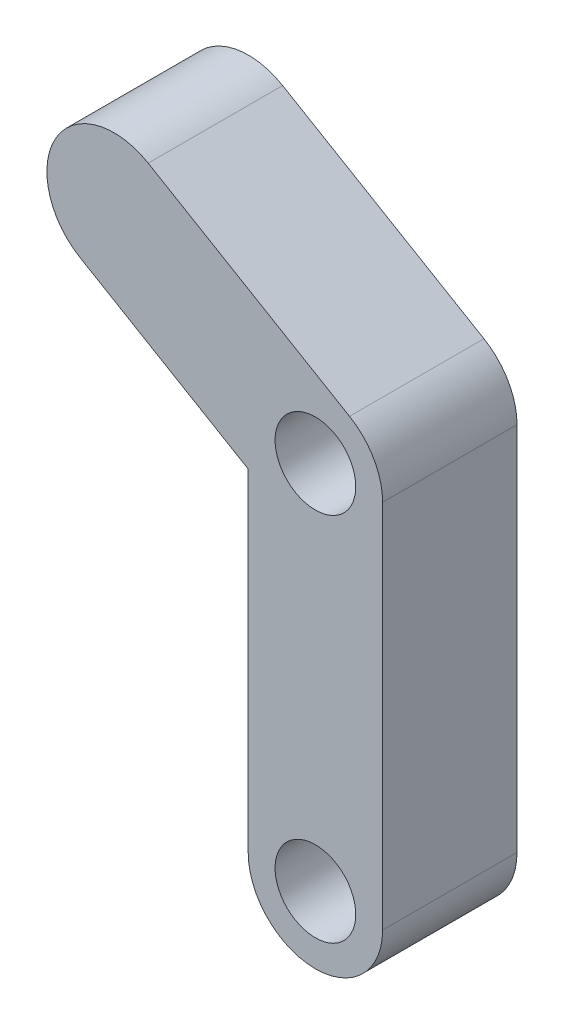
ISO-10303-21;
HEADER;
FILE_DESCRIPTION(('STEP AP214'),'2;1');
FILE_NAME('part.step','',(''),(''),'','','');
FILE_SCHEMA(('AUTOMOTIVE_DESIGN { 1 0 10303 214 1 1 1 1 }'));
ENDSEC;
DATA;
#1=APPLICATION_CONTEXT('core data for automotive mechanical design processes');
#2=APPLICATION_PROTOCOL_DEFINITION('international standard','automotive_design',2000,#1);
#3=PRODUCT_CONTEXT('',#1,'mechanical');
#4=PRODUCT('Part','Part','',(#3));
#5=PRODUCT_RELATED_PRODUCT_CATEGORY('part','',(#4));
#6=PRODUCT_DEFINITION_FORMATION('','',#4);
#7=PRODUCT_DEFINITION_CONTEXT('part definition',#1,'design');
#8=PRODUCT_DEFINITION('design','',#6,#7);
#9=PRODUCT_DEFINITION_SHAPE('','',#8);
#10=(LENGTH_UNIT() NAMED_UNIT(*) SI_UNIT(.MILLI.,.METRE.));
#11=(NAMED_UNIT(*) PLANE_ANGLE_UNIT() SI_UNIT($,.RADIAN.));
#12=(NAMED_UNIT(*) SI_UNIT($,.STERADIAN.) SOLID_ANGLE_UNIT());
#13=UNCERTAINTY_MEASURE_WITH_UNIT(LENGTH_MEASURE(1.E-05),#10,'distance_accuracy_value','');
#14=(GEOMETRIC_REPRESENTATION_CONTEXT(3) GLOBAL_UNCERTAINTY_ASSIGNED_CONTEXT((#13)) GLOBAL_UNIT_ASSIGNED_CONTEXT((#10,
#11,#12)) REPRESENTATION_CONTEXT('',''));
#15=CARTESIAN_POINT('',(0.,0.,0.));
#16=DIRECTION('',(0.,0.,1.));
#17=DIRECTION('',(1.,0.,0.));
#18=AXIS2_PLACEMENT_3D('',#15,#16,#17);
#19=CARTESIAN_POINT('',(4.75728387478869,8.0762653823934,5.));
#20=DIRECTION('',(-0.507538362960708,-0.861629160441523,0.));
#21=DIRECTION('',(0.861629160441523,-0.507538362960708,0.));
#22=AXIS2_PLACEMENT_3D('',#19,#20,#21);
#23=PLANE('',#22);
#24=DIRECTION('',(-0.861629160441523,0.507538362960708,0.));
#25=VECTOR('',#24,1.);
#26=CARTESIAN_POINT('',(4.75728387478869,8.0762653823934,0.));
#27=LINE('',#26,#25);
#28=CARTESIAN_POINT('',(-2.5,12.3511322815869,0.));
#29=VERTEX_POINT('',#28);
#30=CARTESIAN_POINT('',(-8.75690329610147,16.0367299863809,0.));
#31=VERTEX_POINT('',#30);
#32=EDGE_CURVE('E137',#29,#31,#27,.T.);
#33=ORIENTED_EDGE('',*,*,#32,.F.);
#34=DIRECTION('',(0.,0.,-1.));
#35=VECTOR('',#34,1.);
#36=CARTESIAN_POINT('',(-2.5,12.3511322815869,5.));
#37=LINE('',#36,#35);
#38=CARTESIAN_POINT('',(-2.5,12.3511322815869,5.));
#39=VERTEX_POINT('',#38);
#40=EDGE_CURVE('E11',#39,#29,#37,.T.);
#41=ORIENTED_EDGE('',*,*,#40,.F.);
#42=DIRECTION('',(-0.861629160441523,0.507538362960708,0.));
#43=VECTOR('',#42,1.);
#44=CARTESIAN_POINT('',(4.75728387478869,8.0762653823934,5.));
#45=LINE('',#44,#43);
#46=CARTESIAN_POINT('',(-8.75690329610147,16.0367299863809,5.));
#47=VERTEX_POINT('',#46);
#48=EDGE_CURVE('E159',#39,#47,#45,.T.);
#49=ORIENTED_EDGE('',*,*,#48,.T.);
#50=DIRECTION('',(0.,0.,-1.));
#51=VECTOR('',#50,1.);
#52=CARTESIAN_POINT('',(-8.75690329610147,16.0367299863809,5.));
#53=LINE('',#52,#51);
#54=EDGE_CURVE('E90',#47,#31,#53,.T.);
#55=ORIENTED_EDGE('',*,*,#54,.T.);
#56=EDGE_LOOP('',(#33,#41,#49,#55));
#57=FACE_BOUND('',#56,.T.);
#58=ADVANCED_FACE('F43',(#57),#23,.T.);
#59=CARTESIAN_POINT('',(-2.5,0.,5.));
#60=DIRECTION('',(1.,0.,0.));
#61=DIRECTION('',(0.,1.,0.));
#62=AXIS2_PLACEMENT_3D('',#59,#60,#61);
#63=PLANE('',#62);
#64=DIRECTION('',(0.,-1.,0.));
#65=VECTOR('',#64,1.);
#66=CARTESIAN_POINT('',(-2.5,0.,0.));
#67=LINE('',#66,#65);
#68=CARTESIAN_POINT('',(-2.5,0.,0.));
#69=VERTEX_POINT('',#68);
#70=EDGE_CURVE('E140',#29,#69,#67,.T.);
#71=ORIENTED_EDGE('',*,*,#70,.T.);
#72=DIRECTION('',(0.,0.,-1.));
#73=VECTOR('',#72,1.);
#74=CARTESIAN_POINT('',(-2.5,0.,5.));
#75=LINE('',#74,#73);
#76=CARTESIAN_POINT('',(-2.5,0.,5.));
#77=VERTEX_POINT('',#76);
#78=EDGE_CURVE('E51',#77,#69,#75,.T.);
#79=ORIENTED_EDGE('',*,*,#78,.F.);
#80=DIRECTION('',(0.,-1.,0.));
#81=VECTOR('',#80,1.);
#82=CARTESIAN_POINT('',(-2.5,0.,5.));
#83=LINE('',#82,#81);
#84=EDGE_CURVE('E180',#39,#77,#83,.T.);
#85=ORIENTED_EDGE('',*,*,#84,.F.);
#86=ORIENTED_EDGE('',*,*,#40,.T.);
#87=EDGE_LOOP('',(#71,#79,#85,#86));
#88=FACE_BOUND('',#87,.T.);
#89=ADVANCED_FACE('F184',(#88),#63,.F.);
#90=CARTESIAN_POINT('',(0.,0.,5.));
#91=DIRECTION('',(0.,0.,-1.));
#92=DIRECTION('',(-1.,0.,0.));
#93=AXIS2_PLACEMENT_3D('',#90,#91,#92);
#94=CYLINDRICAL_SURFACE('',#93,2.5);
#95=CARTESIAN_POINT('',(0.,0.,0.));
#96=DIRECTION('',(0.,0.,1.));
#97=DIRECTION('',(1.,0.,0.));
#98=AXIS2_PLACEMENT_3D('',#95,#96,#97);
#99=CIRCLE('',#98,2.5);
#100=CARTESIAN_POINT('',(2.5,0.,0.));
#101=VERTEX_POINT('',#100);
#102=EDGE_CURVE('E142',#69,#101,#99,.T.);
#103=ORIENTED_EDGE('',*,*,#102,.T.);
#104=DIRECTION('',(0.,0.,-1.));
#105=VECTOR('',#104,1.);
#106=CARTESIAN_POINT('',(2.5,0.,5.));
#107=LINE('',#106,#105);
#108=CARTESIAN_POINT('',(2.5,0.,5.));
#109=VERTEX_POINT('',#108);
#110=EDGE_CURVE('E163',#109,#101,#107,.T.);
#111=ORIENTED_EDGE('',*,*,#110,.F.);
#112=CARTESIAN_POINT('',(0.,0.,5.));
#113=DIRECTION('',(0.,0.,1.));
#114=DIRECTION('',(1.,0.,0.));
#115=AXIS2_PLACEMENT_3D('',#112,#113,#114);
#116=CIRCLE('',#115,2.5);
#117=EDGE_CURVE('E171',#77,#109,#116,.T.);
#118=ORIENTED_EDGE('',*,*,#117,.F.);
#119=ORIENTED_EDGE('',*,*,#78,.T.);
#120=EDGE_LOOP('',(#103,#111,#118,#119));
#121=FACE_BOUND('',#120,.T.);
#122=ADVANCED_FACE('F169',(#121),#94,.T.);
#123=CARTESIAN_POINT('',(2.5,0.,5.));
#124=DIRECTION('',(1.,0.,0.));
#125=DIRECTION('',(0.,1.,0.));
#126=AXIS2_PLACEMENT_3D('',#123,#124,#125);
#127=PLANE('',#126);
#128=DIRECTION('',(0.,-1.,0.));
#129=VECTOR('',#128,1.);
#130=CARTESIAN_POINT('',(2.5,0.,0.));
#131=LINE('',#130,#129);
#132=CARTESIAN_POINT('',(2.5,13.78,0.));
#133=VERTEX_POINT('',#132);
#134=EDGE_CURVE('E145',#133,#101,#131,.T.);
#135=ORIENTED_EDGE('',*,*,#134,.F.);
#136=DIRECTION('',(0.,0.,-1.));
#137=VECTOR('',#136,1.);
#138=CARTESIAN_POINT('',(2.5,13.78,5.));
#139=LINE('',#138,#137);
#140=CARTESIAN_POINT('',(2.5,13.78,5.));
#141=VERTEX_POINT('',#140);
#142=EDGE_CURVE('E124',#141,#133,#139,.T.);
#143=ORIENTED_EDGE('',*,*,#142,.F.);
#144=DIRECTION('',(0.,-1.,0.));
#145=VECTOR('',#144,1.);
#146=CARTESIAN_POINT('',(2.5,0.,5.));
#147=LINE('',#146,#145);
#148=EDGE_CURVE('E113',#141,#109,#147,.T.);
#149=ORIENTED_EDGE('',*,*,#148,.T.);
#150=ORIENTED_EDGE('',*,*,#110,.T.);
#151=EDGE_LOOP('',(#135,#143,#149,#150));
#152=FACE_BOUND('',#151,.T.);
#153=ADVANCED_FACE('F179',(#152),#127,.T.);
#154=CARTESIAN_POINT('',(0.,13.78,5.));
#155=DIRECTION('',(0.,0.,-1.));
#156=DIRECTION('',(-1.,0.,0.));
#157=AXIS2_PLACEMENT_3D('',#154,#155,#156);
#158=CYLINDRICAL_SURFACE('',#157,2.5);
#159=CARTESIAN_POINT('',(0.,13.78,0.));
#160=DIRECTION('',(0.,0.,1.));
#161=DIRECTION('',(1.,0.,0.));
#162=AXIS2_PLACEMENT_3D('',#159,#160,#161);
#163=CIRCLE('',#162,2.5);
#164=CARTESIAN_POINT('',(1.26884590740177,15.9340729011038,0.));
#165=VERTEX_POINT('',#164);
#166=EDGE_CURVE('E120',#133,#165,#163,.T.);
#167=ORIENTED_EDGE('',*,*,#166,.T.);
#168=DIRECTION('',(0.,0.,-1.));
#169=VECTOR('',#168,1.);
#170=CARTESIAN_POINT('',(1.26884590740177,15.9340729011038,5.));
#171=LINE('',#170,#169);
#172=CARTESIAN_POINT('',(1.26884590740177,15.9340729011038,5.));
#173=VERTEX_POINT('',#172);
#174=EDGE_CURVE('E117',#173,#165,#171,.T.);
#175=ORIENTED_EDGE('',*,*,#174,.F.);
#176=CARTESIAN_POINT('',(0.,13.78,5.));
#177=DIRECTION('',(0.,0.,1.));
#178=DIRECTION('',(1.,0.,0.));
#179=AXIS2_PLACEMENT_3D('',#176,#177,#178);
#180=CIRCLE('',#179,2.5);
#181=EDGE_CURVE('E106',#141,#173,#180,.T.);
#182=ORIENTED_EDGE('',*,*,#181,.F.);
#183=ORIENTED_EDGE('',*,*,#142,.T.);
#184=EDGE_LOOP('',(#167,#175,#182,#183));
#185=FACE_BOUND('',#184,.T.);
#186=ADVANCED_FACE('F118',(#185),#158,.T.);
#187=CARTESIAN_POINT('',(7.29497568959223,12.384411184601,5.));
#188=DIRECTION('',(0.507538362960708,0.861629160441524,0.));
#189=DIRECTION('',(-0.861629160441524,0.507538362960708,0.));
#190=AXIS2_PLACEMENT_3D('',#187,#188,#189);
#191=PLANE('',#190);
#192=DIRECTION('',(0.861629160441524,-0.507538362960708,0.));
#193=VECTOR('',#192,1.);
#194=CARTESIAN_POINT('',(7.29497568959223,12.384411184601,0.));
#195=LINE('',#194,#193);
#196=CARTESIAN_POINT('',(-6.21921148129793,20.3448757885885,0.));
#197=VERTEX_POINT('',#196);
#198=EDGE_CURVE('E149',#197,#165,#195,.T.);
#199=ORIENTED_EDGE('',*,*,#198,.F.);
#200=DIRECTION('',(0.,0.,-1.));
#201=VECTOR('',#200,1.);
#202=CARTESIAN_POINT('',(-6.21921148129793,20.3448757885885,5.));
#203=LINE('',#202,#201);
#204=CARTESIAN_POINT('',(-6.21921148129793,20.3448757885885,5.));
#205=VERTEX_POINT('',#204);
#206=EDGE_CURVE('E83',#205,#197,#203,.T.);
#207=ORIENTED_EDGE('',*,*,#206,.F.);
#208=DIRECTION('',(0.861629160441524,-0.507538362960708,0.));
#209=VECTOR('',#208,1.);
#210=CARTESIAN_POINT('',(7.29497568959223,12.384411184601,5.));
#211=LINE('',#210,#209);
#212=EDGE_CURVE('E111',#205,#173,#211,.T.);
#213=ORIENTED_EDGE('',*,*,#212,.T.);
#214=ORIENTED_EDGE('',*,*,#174,.T.);
#215=EDGE_LOOP('',(#199,#207,#213,#214));
#216=FACE_BOUND('',#215,.T.);
#217=ADVANCED_FACE('F126',(#216),#191,.T.);
#218=CARTESIAN_POINT('',(0.,13.78,5.));
#219=DIRECTION('',(0.,0.,-1.));
#220=DIRECTION('',(-1.,0.,0.));
#221=AXIS2_PLACEMENT_3D('',#218,#219,#220);
#222=CYLINDRICAL_SURFACE('',#221,1.5);
#223=CARTESIAN_POINT('',(0.,13.78,5.));
#224=DIRECTION('',(0.,0.,1.));
#225=DIRECTION('',(1.,0.,0.));
#226=AXIS2_PLACEMENT_3D('',#223,#224,#225);
#227=CIRCLE('',#226,1.5);
#228=CARTESIAN_POINT('',(1.5,13.78,5.));
#229=VERTEX_POINT('',#228);
#230=EDGE_CURVE('E128',#229,#229,#227,.T.);
#231=ORIENTED_EDGE('',*,*,#230,.T.);
#232=EDGE_LOOP('',(#231));
#233=FACE_BOUND('',#232,.T.);
#234=CARTESIAN_POINT('',(0.,13.78,0.));
#235=DIRECTION('',(0.,0.,1.));
#236=DIRECTION('',(1.,0.,0.));
#237=AXIS2_PLACEMENT_3D('',#234,#235,#236);
#238=CIRCLE('',#237,1.5);
#239=CARTESIAN_POINT('',(1.5,13.78,0.));
#240=VERTEX_POINT('',#239);
#241=EDGE_CURVE('E153',#240,#240,#238,.T.);
#242=ORIENTED_EDGE('',*,*,#241,.F.);
#243=EDGE_LOOP('',(#242));
#244=FACE_BOUND('',#243,.T.);
#245=ADVANCED_FACE('F198',(#233,#244),#222,.F.);
#246=CARTESIAN_POINT('',(-7.4880573886997,18.1908028874847,5.));
#247=DIRECTION('',(0.,0.,-1.));
#248=DIRECTION('',(-1.,0.,0.));
#249=AXIS2_PLACEMENT_3D('',#246,#247,#248);
#250=CYLINDRICAL_SURFACE('',#249,2.5);
#251=CARTESIAN_POINT('',(-7.4880573886997,18.1908028874847,0.));
#252=DIRECTION('',(0.,0.,1.));
#253=DIRECTION('',(1.,0.,0.));
#254=AXIS2_PLACEMENT_3D('',#251,#252,#253);
#255=CIRCLE('',#254,2.5);
#256=EDGE_CURVE('E151',#197,#31,#255,.T.);
#257=ORIENTED_EDGE('',*,*,#256,.T.);
#258=ORIENTED_EDGE('',*,*,#54,.F.);
#259=CARTESIAN_POINT('',(-7.4880573886997,18.1908028874847,5.));
#260=DIRECTION('',(0.,0.,1.));
#261=DIRECTION('',(1.,0.,0.));
#262=AXIS2_PLACEMENT_3D('',#259,#260,#261);
#263=CIRCLE('',#262,2.5);
#264=EDGE_CURVE('E59',#205,#47,#263,.T.);
#265=ORIENTED_EDGE('',*,*,#264,.F.);
#266=ORIENTED_EDGE('',*,*,#206,.T.);
#267=EDGE_LOOP('',(#257,#258,#265,#266));
#268=FACE_BOUND('',#267,.T.);
#269=ADVANCED_FACE('F199',(#268),#250,.T.);
#270=CARTESIAN_POINT('',(0.,0.,5.));
#271=DIRECTION('',(0.,0.,-1.));
#272=DIRECTION('',(-1.,0.,0.));
#273=AXIS2_PLACEMENT_3D('',#270,#271,#272);
#274=CYLINDRICAL_SURFACE('',#273,1.5);
#275=CARTESIAN_POINT('',(0.,0.,5.));
#276=DIRECTION('',(0.,0.,1.));
#277=DIRECTION('',(1.,0.,0.));
#278=AXIS2_PLACEMENT_3D('',#275,#276,#277);
#279=CIRCLE('',#278,1.5);
#280=CARTESIAN_POINT('',(1.5,0.,5.));
#281=VERTEX_POINT('',#280);
#282=EDGE_CURVE('E134',#281,#281,#279,.T.);
#283=ORIENTED_EDGE('',*,*,#282,.T.);
#284=EDGE_LOOP('',(#283));
#285=FACE_BOUND('',#284,.T.);
#286=CARTESIAN_POINT('',(0.,0.,0.));
#287=DIRECTION('',(0.,0.,1.));
#288=DIRECTION('',(1.,0.,0.));
#289=AXIS2_PLACEMENT_3D('',#286,#287,#288);
#290=CIRCLE('',#289,1.5);
#291=CARTESIAN_POINT('',(1.5,0.,0.));
#292=VERTEX_POINT('',#291);
#293=EDGE_CURVE('E156',#292,#292,#290,.T.);
#294=ORIENTED_EDGE('',*,*,#293,.F.);
#295=EDGE_LOOP('',(#294));
#296=FACE_BOUND('',#295,.T.);
#297=ADVANCED_FACE('F202',(#285,#296),#274,.F.);
#298=CARTESIAN_POINT('',(0.,0.,5.));
#299=DIRECTION('',(0.,0.,1.));
#300=DIRECTION('',(1.,0.,0.));
#301=AXIS2_PLACEMENT_3D('',#298,#299,#300);
#302=PLANE('',#301);
#303=ORIENTED_EDGE('',*,*,#48,.F.);
#304=ORIENTED_EDGE('',*,*,#84,.T.);
#305=ORIENTED_EDGE('',*,*,#117,.T.);
#306=ORIENTED_EDGE('',*,*,#148,.F.);
#307=ORIENTED_EDGE('',*,*,#181,.T.);
#308=ORIENTED_EDGE('',*,*,#212,.F.);
#309=ORIENTED_EDGE('',*,*,#264,.T.);
#310=EDGE_LOOP('',(#303,#304,#305,#306,#307,#308,#309));
#311=FACE_BOUND('',#310,.T.);
#312=ORIENTED_EDGE('',*,*,#230,.F.);
#313=EDGE_LOOP('',(#312));
#314=FACE_BOUND('',#313,.T.);
#315=ORIENTED_EDGE('',*,*,#282,.F.);
#316=EDGE_LOOP('',(#315));
#317=FACE_BOUND('',#316,.T.);
#318=ADVANCED_FACE('F108',(#311,#314,#317),#302,.T.);
#319=CARTESIAN_POINT('',(0.,0.,0.));
#320=DIRECTION('',(0.,0.,1.));
#321=DIRECTION('',(1.,0.,0.));
#322=AXIS2_PLACEMENT_3D('',#319,#320,#321);
#323=PLANE('',#322);
#324=ORIENTED_EDGE('',*,*,#32,.T.);
#325=ORIENTED_EDGE('',*,*,#256,.F.);
#326=ORIENTED_EDGE('',*,*,#198,.T.);
#327=ORIENTED_EDGE('',*,*,#166,.F.);
#328=ORIENTED_EDGE('',*,*,#134,.T.);
#329=ORIENTED_EDGE('',*,*,#102,.F.);
#330=ORIENTED_EDGE('',*,*,#70,.F.);
#331=EDGE_LOOP('',(#324,#325,#326,#327,#328,#329,#330));
#332=FACE_BOUND('',#331,.T.);
#333=ORIENTED_EDGE('',*,*,#241,.T.);
#334=EDGE_LOOP('',(#333));
#335=FACE_BOUND('',#334,.T.);
#336=ORIENTED_EDGE('',*,*,#293,.T.);
#337=EDGE_LOOP('',(#336));
#338=FACE_BOUND('',#337,.T.);
#339=ADVANCED_FACE('F175',(#332,#335,#338),#323,.F.);
#340=CLOSED_SHELL('',(#58,#89,#122,#153,#186,#217,#245,#269,#297,#318,#339));
#341=MANIFOLD_SOLID_BREP('B2',#340);
#342=ADVANCED_BREP_SHAPE_REPRESENTATION('',(#18,#341),#14);
#343=SHAPE_DEFINITION_REPRESENTATION(#9,#342);
ENDSEC;
END-ISO-10303-21;
